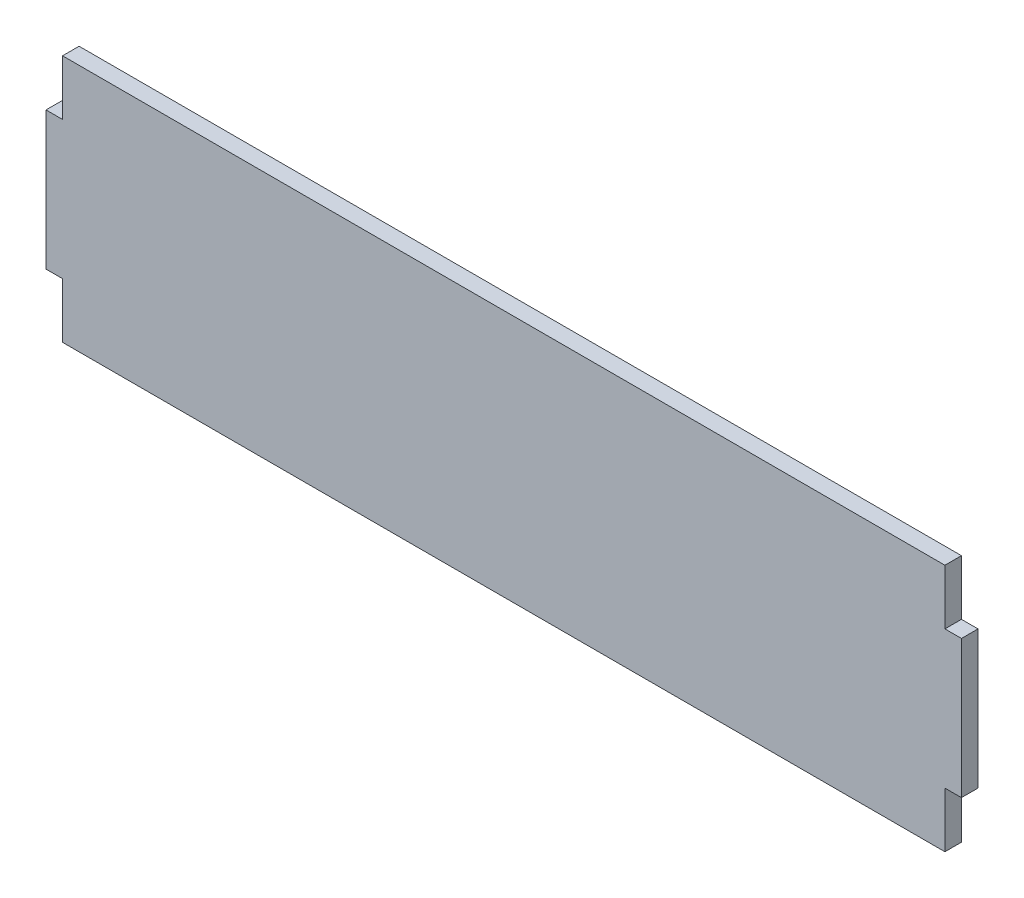
ISO-10303-21;
HEADER;
FILE_DESCRIPTION(('STEP AP214'),'2;1');
FILE_NAME('part.step','',(''),(''),'','','');
FILE_SCHEMA(('AUTOMOTIVE_DESIGN { 1 0 10303 214 1 1 1 1 }'));
ENDSEC;
DATA;
#1=APPLICATION_CONTEXT('core data for automotive mechanical design processes');
#2=APPLICATION_PROTOCOL_DEFINITION('international standard','automotive_design',2000,#1);
#3=PRODUCT_CONTEXT('',#1,'mechanical');
#4=PRODUCT('Part','Part','',(#3));
#5=PRODUCT_RELATED_PRODUCT_CATEGORY('part','',(#4));
#6=PRODUCT_DEFINITION_FORMATION('','',#4);
#7=PRODUCT_DEFINITION_CONTEXT('part definition',#1,'design');
#8=PRODUCT_DEFINITION('design','',#6,#7);
#9=PRODUCT_DEFINITION_SHAPE('','',#8);
#10=(LENGTH_UNIT() NAMED_UNIT(*) SI_UNIT(.MILLI.,.METRE.));
#11=(NAMED_UNIT(*) PLANE_ANGLE_UNIT() SI_UNIT($,.RADIAN.));
#12=(NAMED_UNIT(*) SI_UNIT($,.STERADIAN.) SOLID_ANGLE_UNIT());
#13=UNCERTAINTY_MEASURE_WITH_UNIT(LENGTH_MEASURE(1.E-05),#10,'distance_accuracy_value','');
#14=(GEOMETRIC_REPRESENTATION_CONTEXT(3) GLOBAL_UNCERTAINTY_ASSIGNED_CONTEXT((#13)) GLOBAL_UNIT_ASSIGNED_CONTEXT((#10,
#11,#12)) REPRESENTATION_CONTEXT('',''));
#15=CARTESIAN_POINT('',(0.,0.,0.));
#16=DIRECTION('',(0.,0.,1.));
#17=DIRECTION('',(1.,0.,0.));
#18=AXIS2_PLACEMENT_3D('',#15,#16,#17);
#19=CARTESIAN_POINT('',(160.,-7.10843373493977,6.));
#20=DIRECTION('',(-1.,0.,0.));
#21=DIRECTION('',(0.,0.,1.));
#22=AXIS2_PLACEMENT_3D('',#19,#20,#21);
#23=PLANE('',#22);
#24=DIRECTION('',(0.,1.,0.));
#25=VECTOR('',#24,1.);
#26=CARTESIAN_POINT('',(160.,-7.10843373493977,0.));
#27=LINE('',#26,#25);
#28=CARTESIAN_POINT('',(160.,-27.1084337349397,0.));
#29=VERTEX_POINT('',#28);
#30=CARTESIAN_POINT('',(160.,-7.10843373493977,0.));
#31=VERTEX_POINT('',#30);
#32=EDGE_CURVE('E153',#29,#31,#27,.T.);
#33=ORIENTED_EDGE('',*,*,#32,.T.);
#34=DIRECTION('',(0.,0.,-1.));
#35=VECTOR('',#34,1.);
#36=CARTESIAN_POINT('',(160.,-7.10843373493977,6.));
#37=LINE('',#36,#35);
#38=CARTESIAN_POINT('',(160.,-7.10843373493977,6.));
#39=VERTEX_POINT('',#38);
#40=EDGE_CURVE('E11',#39,#31,#37,.T.);
#41=ORIENTED_EDGE('',*,*,#40,.F.);
#42=DIRECTION('',(0.,1.,0.));
#43=VECTOR('',#42,1.);
#44=CARTESIAN_POINT('',(160.,-7.10843373493977,6.));
#45=LINE('',#44,#43);
#46=CARTESIAN_POINT('',(160.,-27.1084337349397,6.));
#47=VERTEX_POINT('',#46);
#48=EDGE_CURVE('E175',#47,#39,#45,.T.);
#49=ORIENTED_EDGE('',*,*,#48,.F.);
#50=DIRECTION('',(0.,0.,-1.));
#51=VECTOR('',#50,1.);
#52=CARTESIAN_POINT('',(160.,-27.1084337349397,6.));
#53=LINE('',#52,#51);
#54=EDGE_CURVE('E149',#47,#29,#53,.T.);
#55=ORIENTED_EDGE('',*,*,#54,.T.);
#56=EDGE_LOOP('',(#33,#41,#49,#55));
#57=FACE_BOUND('',#56,.T.);
#58=ADVANCED_FACE('F33',(#57),#23,.F.);
#59=CARTESIAN_POINT('',(160.,-7.10843373493977,6.));
#60=DIRECTION('',(0.,1.,0.));
#61=DIRECTION('',(-1.,0.,0.));
#62=AXIS2_PLACEMENT_3D('',#59,#60,#61);
#63=PLANE('',#62);
#64=DIRECTION('',(1.,0.,0.));
#65=VECTOR('',#64,1.);
#66=CARTESIAN_POINT('',(160.,-7.10843373493977,0.));
#67=LINE('',#66,#65);
#68=CARTESIAN_POINT('',(166.,-7.10843373493979,0.));
#69=VERTEX_POINT('',#68);
#70=EDGE_CURVE('E156',#31,#69,#67,.T.);
#71=ORIENTED_EDGE('',*,*,#70,.T.);
#72=DIRECTION('',(0.,0.,-1.));
#73=VECTOR('',#72,1.);
#74=CARTESIAN_POINT('',(166.,-7.10843373493979,6.));
#75=LINE('',#74,#73);
#76=CARTESIAN_POINT('',(166.,-7.10843373493979,6.));
#77=VERTEX_POINT('',#76);
#78=EDGE_CURVE('E41',#77,#69,#75,.T.);
#79=ORIENTED_EDGE('',*,*,#78,.F.);
#80=DIRECTION('',(1.,0.,0.));
#81=VECTOR('',#80,1.);
#82=CARTESIAN_POINT('',(160.,-7.10843373493977,6.));
#83=LINE('',#82,#81);
#84=EDGE_CURVE('E104',#39,#77,#83,.T.);
#85=ORIENTED_EDGE('',*,*,#84,.F.);
#86=ORIENTED_EDGE('',*,*,#40,.T.);
#87=EDGE_LOOP('',(#71,#79,#85,#86));
#88=FACE_BOUND('',#87,.T.);
#89=ADVANCED_FACE('F253',(#88),#63,.F.);
#90=CARTESIAN_POINT('',(166.,42.8915662650602,6.));
#91=DIRECTION('',(-1.,0.,0.));
#92=DIRECTION('',(0.,-1.,0.));
#93=AXIS2_PLACEMENT_3D('',#90,#91,#92);
#94=PLANE('',#93);
#95=DIRECTION('',(0.,1.,0.));
#96=VECTOR('',#95,1.);
#97=CARTESIAN_POINT('',(166.,42.8915662650602,0.));
#98=LINE('',#97,#96);
#99=CARTESIAN_POINT('',(166.,42.8915662650602,0.));
#100=VERTEX_POINT('',#99);
#101=EDGE_CURVE('E158',#69,#100,#98,.T.);
#102=ORIENTED_EDGE('',*,*,#101,.T.);
#103=DIRECTION('',(0.,0.,-1.));
#104=VECTOR('',#103,1.);
#105=CARTESIAN_POINT('',(166.,42.8915662650602,6.));
#106=LINE('',#105,#104);
#107=CARTESIAN_POINT('',(166.,42.8915662650602,6.));
#108=VERTEX_POINT('',#107);
#109=EDGE_CURVE('E194',#108,#100,#106,.T.);
#110=ORIENTED_EDGE('',*,*,#109,.F.);
#111=DIRECTION('',(0.,1.,0.));
#112=VECTOR('',#111,1.);
#113=CARTESIAN_POINT('',(166.,42.8915662650602,6.));
#114=LINE('',#113,#112);
#115=EDGE_CURVE('E202',#77,#108,#114,.T.);
#116=ORIENTED_EDGE('',*,*,#115,.F.);
#117=ORIENTED_EDGE('',*,*,#78,.T.);
#118=EDGE_LOOP('',(#102,#110,#116,#117));
#119=FACE_BOUND('',#118,.T.);
#120=ADVANCED_FACE('F200',(#119),#94,.F.);
#121=CARTESIAN_POINT('',(160.,42.8915662650602,6.));
#122=DIRECTION('',(0.,-1.,0.));
#123=DIRECTION('',(1.,0.,0.));
#124=AXIS2_PLACEMENT_3D('',#121,#122,#123);
#125=PLANE('',#124);
#126=DIRECTION('',(-1.,0.,0.));
#127=VECTOR('',#126,1.);
#128=CARTESIAN_POINT('',(160.,42.8915662650602,0.));
#129=LINE('',#128,#127);
#130=CARTESIAN_POINT('',(160.,42.8915662650602,0.));
#131=VERTEX_POINT('',#130);
#132=EDGE_CURVE('E160',#100,#131,#129,.T.);
#133=ORIENTED_EDGE('',*,*,#132,.T.);
#134=DIRECTION('',(0.,0.,-1.));
#135=VECTOR('',#134,1.);
#136=CARTESIAN_POINT('',(160.,42.8915662650602,6.));
#137=LINE('',#136,#135);
#138=CARTESIAN_POINT('',(160.,42.8915662650602,6.));
#139=VERTEX_POINT('',#138);
#140=EDGE_CURVE('E191',#139,#131,#137,.T.);
#141=ORIENTED_EDGE('',*,*,#140,.F.);
#142=DIRECTION('',(-1.,0.,0.));
#143=VECTOR('',#142,1.);
#144=CARTESIAN_POINT('',(160.,42.8915662650602,6.));
#145=LINE('',#144,#143);
#146=EDGE_CURVE('E220',#108,#139,#145,.T.);
#147=ORIENTED_EDGE('',*,*,#146,.F.);
#148=ORIENTED_EDGE('',*,*,#109,.T.);
#149=EDGE_LOOP('',(#133,#141,#147,#148));
#150=FACE_BOUND('',#149,.T.);
#151=ADVANCED_FACE('F211',(#150),#125,.F.);
#152=CARTESIAN_POINT('',(160.,62.8915662650603,6.));
#153=DIRECTION('',(-1.,0.,0.));
#154=DIRECTION('',(0.,0.,1.));
#155=AXIS2_PLACEMENT_3D('',#152,#153,#154);
#156=PLANE('',#155);
#157=DIRECTION('',(0.,1.,0.));
#158=VECTOR('',#157,1.);
#159=CARTESIAN_POINT('',(160.,62.8915662650603,0.));
#160=LINE('',#159,#158);
#161=CARTESIAN_POINT('',(160.,62.8915662650603,0.));
#162=VERTEX_POINT('',#161);
#163=EDGE_CURVE('E162',#131,#162,#160,.T.);
#164=ORIENTED_EDGE('',*,*,#163,.T.);
#165=DIRECTION('',(0.,0.,-1.));
#166=VECTOR('',#165,1.);
#167=CARTESIAN_POINT('',(160.,62.8915662650603,6.));
#168=LINE('',#167,#166);
#169=CARTESIAN_POINT('',(160.,62.8915662650603,6.));
#170=VERTEX_POINT('',#169);
#171=EDGE_CURVE('E188',#170,#162,#168,.T.);
#172=ORIENTED_EDGE('',*,*,#171,.F.);
#173=DIRECTION('',(0.,1.,0.));
#174=VECTOR('',#173,1.);
#175=CARTESIAN_POINT('',(160.,62.8915662650603,6.));
#176=LINE('',#175,#174);
#177=EDGE_CURVE('E217',#139,#170,#176,.T.);
#178=ORIENTED_EDGE('',*,*,#177,.F.);
#179=ORIENTED_EDGE('',*,*,#140,.T.);
#180=EDGE_LOOP('',(#164,#172,#178,#179));
#181=FACE_BOUND('',#180,.T.);
#182=ADVANCED_FACE('F215',(#181),#156,.F.);
#183=CARTESIAN_POINT('',(-160.,62.8915662650603,6.));
#184=DIRECTION('',(0.,-1.,0.));
#185=DIRECTION('',(0.,0.,-1.));
#186=AXIS2_PLACEMENT_3D('',#183,#184,#185);
#187=PLANE('',#186);
#188=DIRECTION('',(-1.,0.,0.));
#189=VECTOR('',#188,1.);
#190=CARTESIAN_POINT('',(-160.,62.8915662650603,0.));
#191=LINE('',#190,#189);
#192=CARTESIAN_POINT('',(-160.,62.8915662650603,0.));
#193=VERTEX_POINT('',#192);
#194=EDGE_CURVE('E164',#162,#193,#191,.T.);
#195=ORIENTED_EDGE('',*,*,#194,.T.);
#196=DIRECTION('',(0.,0.,-1.));
#197=VECTOR('',#196,1.);
#198=CARTESIAN_POINT('',(-160.,62.8915662650603,6.));
#199=LINE('',#198,#197);
#200=CARTESIAN_POINT('',(-160.,62.8915662650603,6.));
#201=VERTEX_POINT('',#200);
#202=EDGE_CURVE('E185',#201,#193,#199,.T.);
#203=ORIENTED_EDGE('',*,*,#202,.F.);
#204=DIRECTION('',(-1.,0.,0.));
#205=VECTOR('',#204,1.);
#206=CARTESIAN_POINT('',(-160.,62.8915662650603,6.));
#207=LINE('',#206,#205);
#208=EDGE_CURVE('E219',#170,#201,#207,.T.);
#209=ORIENTED_EDGE('',*,*,#208,.F.);
#210=ORIENTED_EDGE('',*,*,#171,.T.);
#211=EDGE_LOOP('',(#195,#203,#209,#210));
#212=FACE_BOUND('',#211,.T.);
#213=ADVANCED_FACE('F266',(#212),#187,.F.);
#214=CARTESIAN_POINT('',(-160.,62.8915662650603,6.));
#215=DIRECTION('',(1.,0.,0.));
#216=DIRECTION('',(0.,1.,0.));
#217=AXIS2_PLACEMENT_3D('',#214,#215,#216);
#218=PLANE('',#217);
#219=DIRECTION('',(0.,-1.,0.));
#220=VECTOR('',#219,1.);
#221=CARTESIAN_POINT('',(-160.,62.8915662650603,0.));
#222=LINE('',#221,#220);
#223=CARTESIAN_POINT('',(-160.,42.8915662650602,0.));
#224=VERTEX_POINT('',#223);
#225=EDGE_CURVE('E166',#193,#224,#222,.T.);
#226=ORIENTED_EDGE('',*,*,#225,.T.);
#227=DIRECTION('',(0.,0.,-1.));
#228=VECTOR('',#227,1.);
#229=CARTESIAN_POINT('',(-160.,42.8915662650602,6.));
#230=LINE('',#229,#228);
#231=CARTESIAN_POINT('',(-160.,42.8915662650602,6.));
#232=VERTEX_POINT('',#231);
#233=EDGE_CURVE('E182',#232,#224,#230,.T.);
#234=ORIENTED_EDGE('',*,*,#233,.F.);
#235=DIRECTION('',(0.,-1.,0.));
#236=VECTOR('',#235,1.);
#237=CARTESIAN_POINT('',(-160.,62.8915662650603,6.));
#238=LINE('',#237,#236);
#239=EDGE_CURVE('E222',#201,#232,#238,.T.);
#240=ORIENTED_EDGE('',*,*,#239,.F.);
#241=ORIENTED_EDGE('',*,*,#202,.T.);
#242=EDGE_LOOP('',(#226,#234,#240,#241));
#243=FACE_BOUND('',#242,.T.);
#244=ADVANCED_FACE('F269',(#243),#218,.F.);
#245=CARTESIAN_POINT('',(-160.,42.8915662650602,6.));
#246=DIRECTION('',(0.,-1.,0.));
#247=DIRECTION('',(1.,0.,0.));
#248=AXIS2_PLACEMENT_3D('',#245,#246,#247);
#249=PLANE('',#248);
#250=DIRECTION('',(-1.,0.,0.));
#251=VECTOR('',#250,1.);
#252=CARTESIAN_POINT('',(-160.,42.8915662650602,0.));
#253=LINE('',#252,#251);
#254=CARTESIAN_POINT('',(-166.,42.8915662650602,0.));
#255=VERTEX_POINT('',#254);
#256=EDGE_CURVE('E168',#224,#255,#253,.T.);
#257=ORIENTED_EDGE('',*,*,#256,.T.);
#258=DIRECTION('',(0.,0.,-1.));
#259=VECTOR('',#258,1.);
#260=CARTESIAN_POINT('',(-166.,42.8915662650602,6.));
#261=LINE('',#260,#259);
#262=CARTESIAN_POINT('',(-166.,42.8915662650602,6.));
#263=VERTEX_POINT('',#262);
#264=EDGE_CURVE('E179',#263,#255,#261,.T.);
#265=ORIENTED_EDGE('',*,*,#264,.F.);
#266=DIRECTION('',(-1.,0.,0.));
#267=VECTOR('',#266,1.);
#268=CARTESIAN_POINT('',(-160.,42.8915662650602,6.));
#269=LINE('',#268,#267);
#270=EDGE_CURVE('E228',#232,#263,#269,.T.);
#271=ORIENTED_EDGE('',*,*,#270,.F.);
#272=ORIENTED_EDGE('',*,*,#233,.T.);
#273=EDGE_LOOP('',(#257,#265,#271,#272));
#274=FACE_BOUND('',#273,.T.);
#275=ADVANCED_FACE('F234',(#274),#249,.F.);
#276=CARTESIAN_POINT('',(-166.,42.8915662650602,6.));
#277=DIRECTION('',(1.,0.,0.));
#278=DIRECTION('',(0.,1.,0.));
#279=AXIS2_PLACEMENT_3D('',#276,#277,#278);
#280=PLANE('',#279);
#281=DIRECTION('',(0.,-1.,0.));
#282=VECTOR('',#281,1.);
#283=CARTESIAN_POINT('',(-166.,42.8915662650602,0.));
#284=LINE('',#283,#282);
#285=CARTESIAN_POINT('',(-166.,-7.10843373493983,0.));
#286=VERTEX_POINT('',#285);
#287=EDGE_CURVE('E170',#255,#286,#284,.T.);
#288=ORIENTED_EDGE('',*,*,#287,.T.);
#289=DIRECTION('',(0.,0.,-1.));
#290=VECTOR('',#289,1.);
#291=CARTESIAN_POINT('',(-166.,-7.10843373493983,6.));
#292=LINE('',#291,#290);
#293=CARTESIAN_POINT('',(-166.,-7.10843373493983,6.));
#294=VERTEX_POINT('',#293);
#295=EDGE_CURVE('E144',#294,#286,#292,.T.);
#296=ORIENTED_EDGE('',*,*,#295,.F.);
#297=DIRECTION('',(0.,-1.,0.));
#298=VECTOR('',#297,1.);
#299=CARTESIAN_POINT('',(-166.,42.8915662650602,6.));
#300=LINE('',#299,#298);
#301=EDGE_CURVE('E135',#263,#294,#300,.T.);
#302=ORIENTED_EDGE('',*,*,#301,.F.);
#303=ORIENTED_EDGE('',*,*,#264,.T.);
#304=EDGE_LOOP('',(#288,#296,#302,#303));
#305=FACE_BOUND('',#304,.T.);
#306=ADVANCED_FACE('F238',(#305),#280,.F.);
#307=CARTESIAN_POINT('',(-160.,-7.10843373493976,6.));
#308=DIRECTION('',(0.,1.,0.));
#309=DIRECTION('',(-1.,0.,0.));
#310=AXIS2_PLACEMENT_3D('',#307,#308,#309);
#311=PLANE('',#310);
#312=DIRECTION('',(1.,0.,0.));
#313=VECTOR('',#312,1.);
#314=CARTESIAN_POINT('',(-160.,-7.10843373493976,0.));
#315=LINE('',#314,#313);
#316=CARTESIAN_POINT('',(-160.,-7.10843373493976,0.));
#317=VERTEX_POINT('',#316);
#318=EDGE_CURVE('E143',#286,#317,#315,.T.);
#319=ORIENTED_EDGE('',*,*,#318,.T.);
#320=DIRECTION('',(0.,0.,-1.));
#321=VECTOR('',#320,1.);
#322=CARTESIAN_POINT('',(-160.,-7.10843373493976,6.));
#323=LINE('',#322,#321);
#324=CARTESIAN_POINT('',(-160.,-7.10843373493976,6.));
#325=VERTEX_POINT('',#324);
#326=EDGE_CURVE('E140',#325,#317,#323,.T.);
#327=ORIENTED_EDGE('',*,*,#326,.F.);
#328=DIRECTION('',(1.,0.,0.));
#329=VECTOR('',#328,1.);
#330=CARTESIAN_POINT('',(-160.,-7.10843373493976,6.));
#331=LINE('',#330,#329);
#332=EDGE_CURVE('E129',#294,#325,#331,.T.);
#333=ORIENTED_EDGE('',*,*,#332,.F.);
#334=ORIENTED_EDGE('',*,*,#295,.T.);
#335=EDGE_LOOP('',(#319,#327,#333,#334));
#336=FACE_BOUND('',#335,.T.);
#337=ADVANCED_FACE('F141',(#336),#311,.F.);
#338=CARTESIAN_POINT('',(-160.,-7.10843373493976,6.));
#339=DIRECTION('',(1.,0.,0.));
#340=DIRECTION('',(0.,1.,0.));
#341=AXIS2_PLACEMENT_3D('',#338,#339,#340);
#342=PLANE('',#341);
#343=DIRECTION('',(0.,-1.,0.));
#344=VECTOR('',#343,1.);
#345=CARTESIAN_POINT('',(-160.,-7.10843373493976,0.));
#346=LINE('',#345,#344);
#347=CARTESIAN_POINT('',(-160.,-27.1084337349397,0.));
#348=VERTEX_POINT('',#347);
#349=EDGE_CURVE('E90',#317,#348,#346,.T.);
#350=ORIENTED_EDGE('',*,*,#349,.T.);
#351=DIRECTION('',(0.,0.,-1.));
#352=VECTOR('',#351,1.);
#353=CARTESIAN_POINT('',(-160.,-27.1084337349397,6.));
#354=LINE('',#353,#352);
#355=CARTESIAN_POINT('',(-160.,-27.1084337349397,6.));
#356=VERTEX_POINT('',#355);
#357=EDGE_CURVE('E145',#356,#348,#354,.T.);
#358=ORIENTED_EDGE('',*,*,#357,.F.);
#359=DIRECTION('',(0.,-1.,0.));
#360=VECTOR('',#359,1.);
#361=CARTESIAN_POINT('',(-160.,-7.10843373493976,6.));
#362=LINE('',#361,#360);
#363=EDGE_CURVE('E133',#325,#356,#362,.T.);
#364=ORIENTED_EDGE('',*,*,#363,.F.);
#365=ORIENTED_EDGE('',*,*,#326,.T.);
#366=EDGE_LOOP('',(#350,#358,#364,#365));
#367=FACE_BOUND('',#366,.T.);
#368=ADVANCED_FACE('F147',(#367),#342,.F.);
#369=CARTESIAN_POINT('',(-160.,-27.1084337349397,6.));
#370=DIRECTION('',(0.,1.,0.));
#371=DIRECTION('',(0.,0.,1.));
#372=AXIS2_PLACEMENT_3D('',#369,#370,#371);
#373=PLANE('',#372);
#374=DIRECTION('',(1.,0.,0.));
#375=VECTOR('',#374,1.);
#376=CARTESIAN_POINT('',(-160.,-27.1084337349397,0.));
#377=LINE('',#376,#375);
#378=EDGE_CURVE('E96',#348,#29,#377,.T.);
#379=ORIENTED_EDGE('',*,*,#378,.T.);
#380=ORIENTED_EDGE('',*,*,#54,.F.);
#381=DIRECTION('',(1.,0.,0.));
#382=VECTOR('',#381,1.);
#383=CARTESIAN_POINT('',(-160.,-27.1084337349397,6.));
#384=LINE('',#383,#382);
#385=EDGE_CURVE('E49',#356,#47,#384,.T.);
#386=ORIENTED_EDGE('',*,*,#385,.F.);
#387=ORIENTED_EDGE('',*,*,#357,.T.);
#388=EDGE_LOOP('',(#379,#380,#386,#387));
#389=FACE_BOUND('',#388,.T.);
#390=ADVANCED_FACE('F242',(#389),#373,.F.);
#391=CARTESIAN_POINT('',(0.,0.,6.));
#392=DIRECTION('',(0.,0.,1.));
#393=DIRECTION('',(1.,0.,0.));
#394=AXIS2_PLACEMENT_3D('',#391,#392,#393);
#395=PLANE('',#394);
#396=ORIENTED_EDGE('',*,*,#48,.T.);
#397=ORIENTED_EDGE('',*,*,#84,.T.);
#398=ORIENTED_EDGE('',*,*,#115,.T.);
#399=ORIENTED_EDGE('',*,*,#146,.T.);
#400=ORIENTED_EDGE('',*,*,#177,.T.);
#401=ORIENTED_EDGE('',*,*,#208,.T.);
#402=ORIENTED_EDGE('',*,*,#239,.T.);
#403=ORIENTED_EDGE('',*,*,#270,.T.);
#404=ORIENTED_EDGE('',*,*,#301,.T.);
#405=ORIENTED_EDGE('',*,*,#332,.T.);
#406=ORIENTED_EDGE('',*,*,#363,.T.);
#407=ORIENTED_EDGE('',*,*,#385,.T.);
#408=EDGE_LOOP('',(#396,#397,#398,#399,#400,#401,#402,#403,#404,#405,#406,#407));
#409=FACE_BOUND('',#408,.T.);
#410=ADVANCED_FACE('F131',(#409),#395,.T.);
#411=CARTESIAN_POINT('',(0.,0.,0.));
#412=DIRECTION('',(0.,0.,1.));
#413=DIRECTION('',(1.,0.,0.));
#414=AXIS2_PLACEMENT_3D('',#411,#412,#413);
#415=PLANE('',#414);
#416=ORIENTED_EDGE('',*,*,#32,.F.);
#417=ORIENTED_EDGE('',*,*,#378,.F.);
#418=ORIENTED_EDGE('',*,*,#349,.F.);
#419=ORIENTED_EDGE('',*,*,#318,.F.);
#420=ORIENTED_EDGE('',*,*,#287,.F.);
#421=ORIENTED_EDGE('',*,*,#256,.F.);
#422=ORIENTED_EDGE('',*,*,#225,.F.);
#423=ORIENTED_EDGE('',*,*,#194,.F.);
#424=ORIENTED_EDGE('',*,*,#163,.F.);
#425=ORIENTED_EDGE('',*,*,#132,.F.);
#426=ORIENTED_EDGE('',*,*,#101,.F.);
#427=ORIENTED_EDGE('',*,*,#70,.F.);
#428=EDGE_LOOP('',(#416,#417,#418,#419,#420,#421,#422,#423,#424,#425,#426,#427));
#429=FACE_BOUND('',#428,.T.);
#430=ADVANCED_FACE('F206',(#429),#415,.F.);
#431=CLOSED_SHELL('',(#58,#89,#120,#151,#182,#213,#244,#275,#306,#337,#368,#390,#410,#430));
#432=MANIFOLD_SOLID_BREP('B2',#431);
#433=ADVANCED_BREP_SHAPE_REPRESENTATION('',(#18,#432),#14);
#434=SHAPE_DEFINITION_REPRESENTATION(#9,#433);
ENDSEC;
END-ISO-10303-21;
